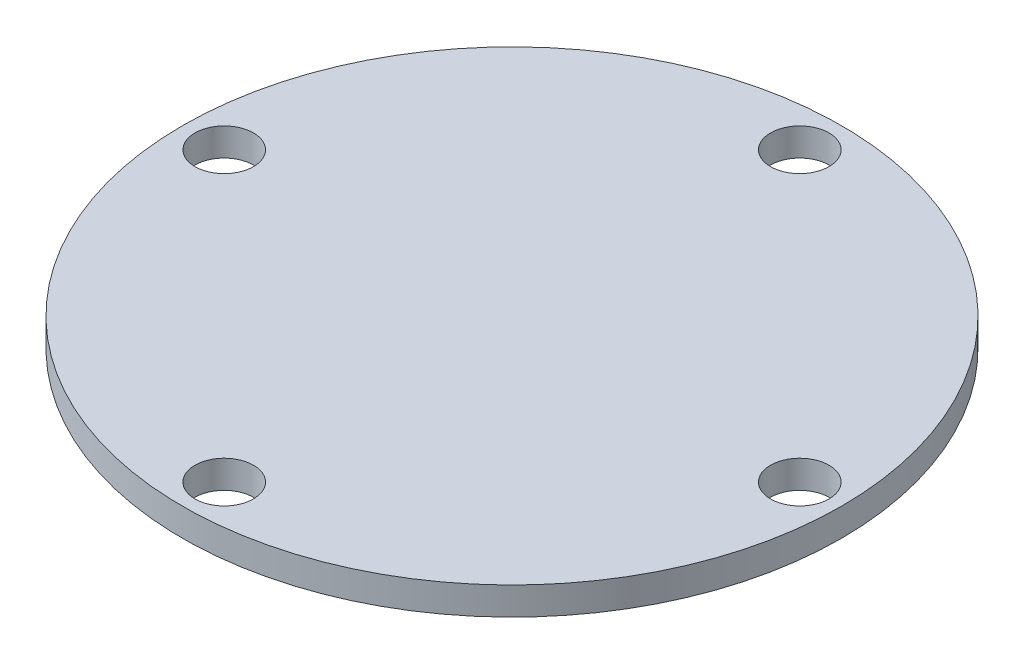
ISO-10303-21;
HEADER;
FILE_DESCRIPTION(('STEP AP214'),'2;1');
FILE_NAME('part.step','',(''),(''),'','','');
FILE_SCHEMA(('AUTOMOTIVE_DESIGN { 1 0 10303 214 1 1 1 1 }'));
ENDSEC;
DATA;
#1=APPLICATION_CONTEXT('core data for automotive mechanical design processes');
#2=APPLICATION_PROTOCOL_DEFINITION('international standard','automotive_design',2000,#1);
#3=PRODUCT_CONTEXT('',#1,'mechanical');
#4=PRODUCT('Part','Part','',(#3));
#5=PRODUCT_RELATED_PRODUCT_CATEGORY('part','',(#4));
#6=PRODUCT_DEFINITION_FORMATION('','',#4);
#7=PRODUCT_DEFINITION_CONTEXT('part definition',#1,'design');
#8=PRODUCT_DEFINITION('design','',#6,#7);
#9=PRODUCT_DEFINITION_SHAPE('','',#8);
#10=(LENGTH_UNIT() NAMED_UNIT(*) SI_UNIT(.MILLI.,.METRE.));
#11=(NAMED_UNIT(*) PLANE_ANGLE_UNIT() SI_UNIT($,.RADIAN.));
#12=(NAMED_UNIT(*) SI_UNIT($,.STERADIAN.) SOLID_ANGLE_UNIT());
#13=UNCERTAINTY_MEASURE_WITH_UNIT(LENGTH_MEASURE(1.E-05),#10,'distance_accuracy_value','');
#14=(GEOMETRIC_REPRESENTATION_CONTEXT(3) GLOBAL_UNCERTAINTY_ASSIGNED_CONTEXT((#13)) GLOBAL_UNIT_ASSIGNED_CONTEXT((#10,
#11,#12)) REPRESENTATION_CONTEXT('',''));
#15=CARTESIAN_POINT('',(0.,0.,0.));
#16=DIRECTION('',(0.,0.,1.));
#17=DIRECTION('',(1.,0.,0.));
#18=AXIS2_PLACEMENT_3D('',#15,#16,#17);
#19=CARTESIAN_POINT('',(0.,3.,-31.));
#20=DIRECTION('',(0.,-1.,0.));
#21=DIRECTION('',(1.,0.,0.));
#22=AXIS2_PLACEMENT_3D('',#19,#20,#21);
#23=CYLINDRICAL_SURFACE('',#22,3.15);
#24=CARTESIAN_POINT('',(0.,3.,-31.));
#25=DIRECTION('',(0.,-1.,0.));
#26=DIRECTION('',(1.,0.,0.));
#27=AXIS2_PLACEMENT_3D('',#24,#25,#26);
#28=CIRCLE('',#27,3.15);
#29=CARTESIAN_POINT('',(-3.15,3.,-31.));
#30=VERTEX_POINT('',#29);
#31=EDGE_CURVE('E95',#30,#30,#28,.T.);
#32=ORIENTED_EDGE('',*,*,#31,.F.);
#33=DIRECTION('',(0.,-1.,0.));
#34=VECTOR('',#33,1.);
#35=CARTESIAN_POINT('',(-3.15,3.,-31.));
#36=LINE('',#35,#34);
#37=CARTESIAN_POINT('',(-3.15,0.,-31.));
#38=VERTEX_POINT('',#37);
#39=EDGE_CURVE('E11',#30,#38,#36,.T.);
#40=ORIENTED_EDGE('',*,*,#39,.T.);
#41=CARTESIAN_POINT('',(0.,0.,-31.));
#42=DIRECTION('',(0.,-1.,0.));
#43=DIRECTION('',(1.,0.,0.));
#44=AXIS2_PLACEMENT_3D('',#41,#42,#43);
#45=CIRCLE('',#44,3.15);
#46=EDGE_CURVE('E118',#38,#38,#45,.T.);
#47=ORIENTED_EDGE('',*,*,#46,.T.);
#48=ORIENTED_EDGE('',*,*,#39,.F.);
#49=EDGE_LOOP('',(#32,#40,#47,#48));
#50=FACE_BOUND('',#49,.T.);
#51=ADVANCED_FACE('F17',(#50),#23,.F.);
#52=CARTESIAN_POINT('',(-31.,3.,0.));
#53=DIRECTION('',(0.,-1.,0.));
#54=DIRECTION('',(1.,0.,0.));
#55=AXIS2_PLACEMENT_3D('',#52,#53,#54);
#56=CYLINDRICAL_SURFACE('',#55,3.15);
#57=CARTESIAN_POINT('',(-31.,3.,0.));
#58=DIRECTION('',(0.,-1.,0.));
#59=DIRECTION('',(1.,0.,0.));
#60=AXIS2_PLACEMENT_3D('',#57,#58,#59);
#61=CIRCLE('',#60,3.15);
#62=CARTESIAN_POINT('',(-34.15,3.,0.));
#63=VERTEX_POINT('',#62);
#64=EDGE_CURVE('E103',#63,#63,#61,.T.);
#65=ORIENTED_EDGE('',*,*,#64,.F.);
#66=DIRECTION('',(0.,-1.,0.));
#67=VECTOR('',#66,1.);
#68=CARTESIAN_POINT('',(-34.15,3.,0.));
#69=LINE('',#68,#67);
#70=CARTESIAN_POINT('',(-34.15,0.,0.));
#71=VERTEX_POINT('',#70);
#72=EDGE_CURVE('E27',#63,#71,#69,.T.);
#73=ORIENTED_EDGE('',*,*,#72,.T.);
#74=CARTESIAN_POINT('',(-31.,0.,0.));
#75=DIRECTION('',(0.,-1.,0.));
#76=DIRECTION('',(1.,0.,0.));
#77=AXIS2_PLACEMENT_3D('',#74,#75,#76);
#78=CIRCLE('',#77,3.15);
#79=EDGE_CURVE('E20',#71,#71,#78,.T.);
#80=ORIENTED_EDGE('',*,*,#79,.T.);
#81=ORIENTED_EDGE('',*,*,#72,.F.);
#82=EDGE_LOOP('',(#65,#73,#80,#81));
#83=FACE_BOUND('',#82,.T.);
#84=ADVANCED_FACE('F159',(#83),#56,.F.);
#85=CARTESIAN_POINT('',(0.,3.,31.));
#86=DIRECTION('',(0.,-1.,0.));
#87=DIRECTION('',(1.,0.,0.));
#88=AXIS2_PLACEMENT_3D('',#85,#86,#87);
#89=CYLINDRICAL_SURFACE('',#88,3.15);
#90=CARTESIAN_POINT('',(0.,3.,31.));
#91=DIRECTION('',(0.,-1.,0.));
#92=DIRECTION('',(1.,0.,0.));
#93=AXIS2_PLACEMENT_3D('',#90,#91,#92);
#94=CIRCLE('',#93,3.15);
#95=CARTESIAN_POINT('',(-3.15,3.,31.));
#96=VERTEX_POINT('',#95);
#97=EDGE_CURVE('E111',#96,#96,#94,.T.);
#98=ORIENTED_EDGE('',*,*,#97,.F.);
#99=DIRECTION('',(0.,-1.,0.));
#100=VECTOR('',#99,1.);
#101=CARTESIAN_POINT('',(-3.15,3.,31.));
#102=LINE('',#101,#100);
#103=CARTESIAN_POINT('',(-3.15,0.,31.));
#104=VERTEX_POINT('',#103);
#105=EDGE_CURVE('E67',#96,#104,#102,.T.);
#106=ORIENTED_EDGE('',*,*,#105,.T.);
#107=CARTESIAN_POINT('',(0.,0.,31.));
#108=DIRECTION('',(0.,-1.,0.));
#109=DIRECTION('',(1.,0.,0.));
#110=AXIS2_PLACEMENT_3D('',#107,#108,#109);
#111=CIRCLE('',#110,3.15);
#112=EDGE_CURVE('E123',#104,#104,#111,.T.);
#113=ORIENTED_EDGE('',*,*,#112,.T.);
#114=ORIENTED_EDGE('',*,*,#105,.F.);
#115=EDGE_LOOP('',(#98,#106,#113,#114));
#116=FACE_BOUND('',#115,.T.);
#117=ADVANCED_FACE('F135',(#116),#89,.F.);
#118=CARTESIAN_POINT('',(31.,3.,0.));
#119=DIRECTION('',(0.,-1.,0.));
#120=DIRECTION('',(1.,0.,0.));
#121=AXIS2_PLACEMENT_3D('',#118,#119,#120);
#122=CYLINDRICAL_SURFACE('',#121,3.15);
#123=CARTESIAN_POINT('',(31.,3.,0.));
#124=DIRECTION('',(0.,-1.,0.));
#125=DIRECTION('',(1.,0.,0.));
#126=AXIS2_PLACEMENT_3D('',#123,#124,#125);
#127=CIRCLE('',#126,3.15);
#128=CARTESIAN_POINT('',(27.85,3.,0.));
#129=VERTEX_POINT('',#128);
#130=EDGE_CURVE('E93',#129,#129,#127,.T.);
#131=ORIENTED_EDGE('',*,*,#130,.F.);
#132=DIRECTION('',(0.,-1.,0.));
#133=VECTOR('',#132,1.);
#134=CARTESIAN_POINT('',(27.85,3.,0.));
#135=LINE('',#134,#133);
#136=CARTESIAN_POINT('',(27.85,0.,0.));
#137=VERTEX_POINT('',#136);
#138=EDGE_CURVE('E77',#129,#137,#135,.T.);
#139=ORIENTED_EDGE('',*,*,#138,.T.);
#140=CARTESIAN_POINT('',(31.,0.,0.));
#141=DIRECTION('',(0.,-1.,0.));
#142=DIRECTION('',(1.,0.,0.));
#143=AXIS2_PLACEMENT_3D('',#140,#141,#142);
#144=CIRCLE('',#143,3.15);
#145=EDGE_CURVE('E92',#137,#137,#144,.T.);
#146=ORIENTED_EDGE('',*,*,#145,.T.);
#147=ORIENTED_EDGE('',*,*,#138,.F.);
#148=EDGE_LOOP('',(#131,#139,#146,#147));
#149=FACE_BOUND('',#148,.T.);
#150=ADVANCED_FACE('F90',(#149),#122,.F.);
#151=CARTESIAN_POINT('',(0.,3.,0.));
#152=DIRECTION('',(0.,-1.,0.));
#153=DIRECTION('',(0.,0.,-1.));
#154=AXIS2_PLACEMENT_3D('',#151,#152,#153);
#155=PLANE('',#154);
#156=ORIENTED_EDGE('',*,*,#31,.T.);
#157=EDGE_LOOP('',(#156));
#158=FACE_BOUND('',#157,.T.);
#159=ORIENTED_EDGE('',*,*,#64,.T.);
#160=EDGE_LOOP('',(#159));
#161=FACE_BOUND('',#160,.T.);
#162=ORIENTED_EDGE('',*,*,#97,.T.);
#163=EDGE_LOOP('',(#162));
#164=FACE_BOUND('',#163,.T.);
#165=ORIENTED_EDGE('',*,*,#130,.T.);
#166=EDGE_LOOP('',(#165));
#167=FACE_BOUND('',#166,.T.);
#168=CARTESIAN_POINT('',(0.,3.,0.));
#169=DIRECTION('',(0.,-1.,0.));
#170=DIRECTION('',(1.,0.,0.));
#171=AXIS2_PLACEMENT_3D('',#168,#169,#170);
#172=CIRCLE('',#171,35.5);
#173=CARTESIAN_POINT('',(35.5,3.,0.));
#174=VERTEX_POINT('',#173);
#175=EDGE_CURVE('E117',#174,#174,#172,.T.);
#176=ORIENTED_EDGE('',*,*,#175,.F.);
#177=EDGE_LOOP('',(#176));
#178=FACE_BOUND('',#177,.T.);
#179=ADVANCED_FACE('F133',(#158,#161,#164,#167,#178),#155,.F.);
#180=CARTESIAN_POINT('',(0.,3.15,0.));
#181=DIRECTION('',(0.,-1.,0.));
#182=DIRECTION('',(-1.,0.,0.));
#183=AXIS2_PLACEMENT_3D('',#180,#181,#182);
#184=CYLINDRICAL_SURFACE('',#183,35.5);
#185=CARTESIAN_POINT('',(0.,0.,0.));
#186=DIRECTION('',(0.,-1.,0.));
#187=DIRECTION('',(1.,0.,0.));
#188=AXIS2_PLACEMENT_3D('',#185,#186,#187);
#189=CIRCLE('',#188,35.5);
#190=CARTESIAN_POINT('',(35.5,0.,0.));
#191=VERTEX_POINT('',#190);
#192=EDGE_CURVE('E112',#191,#191,#189,.T.);
#193=ORIENTED_EDGE('',*,*,#192,.F.);
#194=DIRECTION('',(0.,1.,0.));
#195=VECTOR('',#194,1.);
#196=CARTESIAN_POINT('',(35.5,3.15,0.));
#197=LINE('',#196,#195);
#198=EDGE_CURVE('E87',#191,#174,#197,.T.);
#199=ORIENTED_EDGE('',*,*,#198,.T.);
#200=ORIENTED_EDGE('',*,*,#175,.T.);
#201=ORIENTED_EDGE('',*,*,#198,.F.);
#202=EDGE_LOOP('',(#193,#199,#200,#201));
#203=FACE_BOUND('',#202,.T.);
#204=ADVANCED_FACE('F141',(#203),#184,.T.);
#205=CARTESIAN_POINT('',(0.,0.,0.));
#206=DIRECTION('',(0.,-1.,0.));
#207=DIRECTION('',(0.,0.,-1.));
#208=AXIS2_PLACEMENT_3D('',#205,#206,#207);
#209=PLANE('',#208);
#210=ORIENTED_EDGE('',*,*,#46,.F.);
#211=EDGE_LOOP('',(#210));
#212=FACE_BOUND('',#211,.T.);
#213=ORIENTED_EDGE('',*,*,#79,.F.);
#214=EDGE_LOOP('',(#213));
#215=FACE_BOUND('',#214,.T.);
#216=ORIENTED_EDGE('',*,*,#112,.F.);
#217=EDGE_LOOP('',(#216));
#218=FACE_BOUND('',#217,.T.);
#219=ORIENTED_EDGE('',*,*,#145,.F.);
#220=EDGE_LOOP('',(#219));
#221=FACE_BOUND('',#220,.T.);
#222=ORIENTED_EDGE('',*,*,#192,.T.);
#223=EDGE_LOOP('',(#222));
#224=FACE_BOUND('',#223,.T.);
#225=ADVANCED_FACE('F138',(#212,#215,#218,#221,#224),#209,.T.);
#226=CLOSED_SHELL('',(#51,#84,#117,#150,#179,#204,#225));
#227=MANIFOLD_SOLID_BREP('B1',#226);
#228=ADVANCED_BREP_SHAPE_REPRESENTATION('',(#18,#227),#14);
#229=SHAPE_DEFINITION_REPRESENTATION(#9,#228);
ENDSEC;
END-ISO-10303-21;
